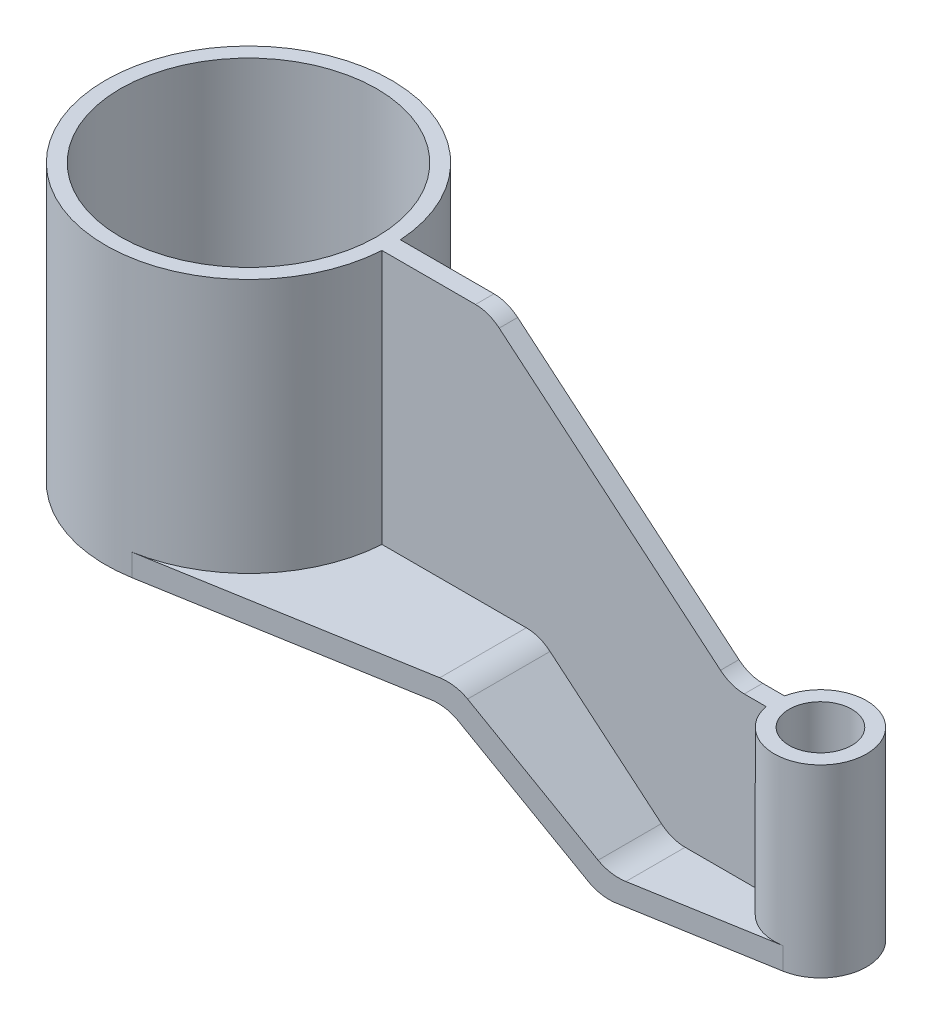
ISO-10303-21;
HEADER;
FILE_DESCRIPTION(('STEP AP214'),'2;1');
FILE_NAME('part.step','',(''),(''),'','','');
FILE_SCHEMA(('AUTOMOTIVE_DESIGN { 1 0 10303 214 1 1 1 1 }'));
ENDSEC;
DATA;
#1=APPLICATION_CONTEXT('core data for automotive mechanical design processes');
#2=APPLICATION_PROTOCOL_DEFINITION('international standard','automotive_design',2000,#1);
#3=PRODUCT_CONTEXT('',#1,'mechanical');
#4=PRODUCT('Part','Part','',(#3));
#5=PRODUCT_RELATED_PRODUCT_CATEGORY('part','',(#4));
#6=PRODUCT_DEFINITION_FORMATION('','',#4);
#7=PRODUCT_DEFINITION_CONTEXT('part definition',#1,'design');
#8=PRODUCT_DEFINITION('design','',#6,#7);
#9=PRODUCT_DEFINITION_SHAPE('','',#8);
#10=(LENGTH_UNIT() NAMED_UNIT(*) SI_UNIT(.MILLI.,.METRE.));
#11=(NAMED_UNIT(*) PLANE_ANGLE_UNIT() SI_UNIT($,.RADIAN.));
#12=(NAMED_UNIT(*) SI_UNIT($,.STERADIAN.) SOLID_ANGLE_UNIT());
#13=UNCERTAINTY_MEASURE_WITH_UNIT(LENGTH_MEASURE(1.E-05),#10,'distance_accuracy_value','');
#14=(GEOMETRIC_REPRESENTATION_CONTEXT(3) GLOBAL_UNCERTAINTY_ASSIGNED_CONTEXT((#13)) GLOBAL_UNIT_ASSIGNED_CONTEXT((#10,
#11,#12)) REPRESENTATION_CONTEXT('',''));
#15=CARTESIAN_POINT('',(0.,0.,0.));
#16=DIRECTION('',(0.,0.,1.));
#17=DIRECTION('',(1.,0.,0.));
#18=AXIS2_PLACEMENT_3D('',#15,#16,#17);
#19=CARTESIAN_POINT('',(-38.75,6.,115.));
#20=DIRECTION('',(0.,-1.,0.));
#21=DIRECTION('',(0.,0.,-1.));
#22=AXIS2_PLACEMENT_3D('',#19,#20,#21);
#23=PLANE('',#22);
#24=DIRECTION('',(-1.,0.,0.));
#25=VECTOR('',#24,1.);
#26=CARTESIAN_POINT('',(-38.75,6.,-2.5));
#27=LINE('',#26,#25);
#28=CARTESIAN_POINT('',(77.7915112851085,6.,-2.5));
#29=VERTEX_POINT('',#28);
#30=CARTESIAN_POINT('',(38.6692707456451,6.00000000000001,-2.5));
#31=VERTEX_POINT('',#30);
#32=EDGE_CURVE('E239',#29,#31,#27,.T.);
#33=ORIENTED_EDGE('',*,*,#32,.F.);
#34=DIRECTION('',(0.,0.,-1.));
#35=VECTOR('',#34,1.);
#36=CARTESIAN_POINT('',(77.7915112851085,6.,115.));
#37=LINE('',#36,#35);
#38=CARTESIAN_POINT('',(77.7915112851085,6.,-25.9504821743771));
#39=VERTEX_POINT('',#38);
#40=EDGE_CURVE('E357',#29,#39,#37,.T.);
#41=ORIENTED_EDGE('',*,*,#40,.T.);
#42=DIRECTION('',(-0.985555142346495,0.,-0.169354838709677));
#43=VECTOR('',#42,1.);
#44=CARTESIAN_POINT('',(-11.8816276712356,6.,-41.3596453272218));
#45=LINE('',#44,#43);
#46=CARTESIAN_POINT('',(6.5625,6.,-38.1902617659267));
#47=VERTEX_POINT('',#46);
#48=EDGE_CURVE('E286',#39,#47,#45,.T.);
#49=ORIENTED_EDGE('',*,*,#48,.T.);
#50=CARTESIAN_POINT('',(0.,6.00000000000001,0.));
#51=DIRECTION('',(0.,-1.,0.));
#52=DIRECTION('',(0.,0.,-1.));
#53=AXIS2_PLACEMENT_3D('',#50,#51,#52);
#54=CIRCLE('',#53,38.75);
#55=EDGE_CURVE('E305',#47,#31,#54,.T.);
#56=ORIENTED_EDGE('',*,*,#55,.T.);
#57=EDGE_LOOP('',(#33,#41,#49,#56));
#58=FACE_BOUND('',#57,.T.);
#59=ADVANCED_FACE('F37',(#58),#23,.F.);
#60=CARTESIAN_POINT('',(167.5,-24.,115.));
#61=DIRECTION('',(0.,-1.,0.));
#62=DIRECTION('',(1.,0.,0.));
#63=AXIS2_PLACEMENT_3D('',#60,#61,#62);
#64=PLANE('',#63);
#65=DIRECTION('',(-0.985555142346495,0.,-0.169354838709677));
#66=VECTOR('',#65,1.);
#67=CARTESIAN_POINT('',(188.452903416173,-24.,-6.93476056683261));
#68=LINE('',#67,#66);
#69=CARTESIAN_POINT('',(157.116935483871,-24.,-12.3194392793312));
#70=VERTEX_POINT('',#69);
#71=CARTESIAN_POINT('',(120.823523748259,-24.,-18.5559902612219));
#72=VERTEX_POINT('',#71);
#73=EDGE_CURVE('E283',#70,#72,#68,.T.);
#74=ORIENTED_EDGE('',*,*,#73,.T.);
#75=DIRECTION('',(0.,0.,-1.));
#76=VECTOR('',#75,1.);
#77=CARTESIAN_POINT('',(120.823523748259,-24.,-2.5));
#78=LINE('',#77,#76);
#79=CARTESIAN_POINT('',(120.823523748259,-24.,-2.5));
#80=VERTEX_POINT('',#79);
#81=EDGE_CURVE('E364',#72,#80,#78,.F.);
#82=ORIENTED_EDGE('',*,*,#81,.T.);
#83=DIRECTION('',(-1.,0.,0.));
#84=VECTOR('',#83,1.);
#85=CARTESIAN_POINT('',(167.5,-24.,-2.5));
#86=LINE('',#85,#84);
#87=CARTESIAN_POINT('',(142.752551286084,-24.,-2.5));
#88=VERTEX_POINT('',#87);
#89=EDGE_CURVE('E228',#88,#80,#86,.T.);
#90=ORIENTED_EDGE('',*,*,#89,.F.);
#91=CARTESIAN_POINT('',(155.,-24.,0.));
#92=DIRECTION('',(0.,-1.,0.));
#93=DIRECTION('',(1.,0.,0.));
#94=AXIS2_PLACEMENT_3D('',#91,#92,#93);
#95=CIRCLE('',#94,12.5);
#96=EDGE_CURVE('E227',#70,#88,#95,.F.);
#97=ORIENTED_EDGE('',*,*,#96,.F.);
#98=EDGE_LOOP('',(#74,#82,#90,#97));
#99=FACE_BOUND('',#98,.T.);
#100=ADVANCED_FACE('F467',(#99),#64,.F.);
#101=CARTESIAN_POINT('',(118.856725658119,-25.4037333412861,115.));
#102=DIRECTION('',(-0.642787609686535,-0.766044443118982,0.));
#103=DIRECTION('',(0.766044443118982,-0.642787609686535,0.));
#104=AXIS2_PLACEMENT_3D('',#101,#102,#103);
#105=PLANE('',#104);
#106=DIRECTION('',(-0.759492568105109,0.637289933778875,-0.130508924205297));
#107=VECTOR('',#106,1.);
#108=CARTESIAN_POINT('',(132.128369582196,-36.539964863095,-16.613399470933));
#109=LINE('',#108,#107);
#110=CARTESIAN_POINT('',(114.395647651394,-21.6604444311898,-19.6605372042155));
#111=VERTEX_POINT('',#110);
#112=CARTESIAN_POINT('',(84.2193873819738,3.66044443118982,-24.8459352313835));
#113=VERTEX_POINT('',#112);
#114=EDGE_CURVE('E281',#111,#113,#109,.T.);
#115=ORIENTED_EDGE('',*,*,#114,.T.);
#116=DIRECTION('',(0.,0.,-1.));
#117=VECTOR('',#116,1.);
#118=CARTESIAN_POINT('',(84.2193873819738,3.66044443118981,115.));
#119=LINE('',#118,#117);
#120=CARTESIAN_POINT('',(84.2193873819738,3.66044443118981,-2.5));
#121=VERTEX_POINT('',#120);
#122=EDGE_CURVE('E52',#113,#121,#119,.F.);
#123=ORIENTED_EDGE('',*,*,#122,.T.);
#124=DIRECTION('',(-0.766044443118982,0.642787609686535,0.));
#125=VECTOR('',#124,1.);
#126=CARTESIAN_POINT('',(118.856725658119,-25.4037333412861,-2.5));
#127=LINE('',#126,#125);
#128=CARTESIAN_POINT('',(114.395647651394,-21.6604444311898,-2.5));
#129=VERTEX_POINT('',#128);
#130=EDGE_CURVE('E231',#129,#121,#127,.T.);
#131=ORIENTED_EDGE('',*,*,#130,.F.);
#132=DIRECTION('',(0.,0.,-1.));
#133=VECTOR('',#132,1.);
#134=CARTESIAN_POINT('',(114.395647651394,-21.6604444311898,-19.1814257916227));
#135=LINE('',#134,#133);
#136=EDGE_CURVE('E360',#129,#111,#135,.T.);
#137=ORIENTED_EDGE('',*,*,#136,.T.);
#138=EDGE_LOOP('',(#115,#123,#131,#137));
#139=FACE_BOUND('',#138,.T.);
#140=ADVANCED_FACE('F459',(#139),#105,.F.);
#141=CARTESIAN_POINT('',(0.,75.,0.));
#142=DIRECTION('',(0.,1.,0.));
#143=DIRECTION('',(0.,0.,1.));
#144=AXIS2_PLACEMENT_3D('',#141,#142,#143);
#145=PLANE('',#144);
#146=CARTESIAN_POINT('',(0.,75.,0.));
#147=DIRECTION('',(0.,1.,0.));
#148=DIRECTION('',(0.,0.,1.));
#149=AXIS2_PLACEMENT_3D('',#146,#147,#148);
#150=CIRCLE('',#149,34.75);
#151=CARTESIAN_POINT('',(0.,75.,34.75));
#152=VERTEX_POINT('',#151);
#153=EDGE_CURVE('E320',#152,#152,#150,.T.);
#154=ORIENTED_EDGE('',*,*,#153,.F.);
#155=EDGE_LOOP('',(#154));
#156=FACE_BOUND('',#155,.T.);
#157=DIRECTION('',(1.,0.,0.));
#158=VECTOR('',#157,1.);
#159=CARTESIAN_POINT('',(64.375,75.,2.5));
#160=LINE('',#159,#158);
#161=CARTESIAN_POINT('',(64.0123617779656,75.,2.5));
#162=VERTEX_POINT('',#161);
#163=CARTESIAN_POINT('',(38.6692707456451,75.,2.5));
#164=VERTEX_POINT('',#163);
#165=EDGE_CURVE('E229',#162,#164,#160,.F.);
#166=ORIENTED_EDGE('',*,*,#165,.F.);
#167=DIRECTION('',(0.,0.,1.));
#168=VECTOR('',#167,1.);
#169=CARTESIAN_POINT('',(64.0123617779656,75.,0.));
#170=LINE('',#169,#168);
#171=CARTESIAN_POINT('',(64.0123617779656,75.,-2.5));
#172=VERTEX_POINT('',#171);
#173=EDGE_CURVE('E350',#162,#172,#170,.F.);
#174=ORIENTED_EDGE('',*,*,#173,.T.);
#175=DIRECTION('',(1.,0.,0.));
#176=VECTOR('',#175,1.);
#177=CARTESIAN_POINT('',(64.375,75.,-2.5));
#178=LINE('',#177,#176);
#179=CARTESIAN_POINT('',(38.6692707456451,75.,-2.5));
#180=VERTEX_POINT('',#179);
#181=EDGE_CURVE('E236',#172,#180,#178,.F.);
#182=ORIENTED_EDGE('',*,*,#181,.T.);
#183=CARTESIAN_POINT('',(0.,75.,0.));
#184=DIRECTION('',(0.,1.,0.));
#185=DIRECTION('',(0.,0.,1.));
#186=AXIS2_PLACEMENT_3D('',#183,#184,#185);
#187=CIRCLE('',#186,38.75);
#188=EDGE_CURVE('E211',#180,#164,#187,.T.);
#189=ORIENTED_EDGE('',*,*,#188,.T.);
#190=EDGE_LOOP('',(#166,#174,#182,#189));
#191=FACE_BOUND('',#190,.T.);
#192=ADVANCED_FACE('F451',(#156,#191),#145,.T.);
#193=DIRECTION('',(-0.985555142346495,0.,0.169354838709677));
#194=VECTOR('',#193,1.);
#195=CARTESIAN_POINT('',(-50.2705900706999,6.,47.9562894479293));
#196=LINE('',#195,#194);
#197=CARTESIAN_POINT('',(77.7915112851085,6.,25.9504821743771));
#198=VERTEX_POINT('',#197);
#199=CARTESIAN_POINT('',(6.5625,6.,38.1902617659267));
#200=VERTEX_POINT('',#199);
#201=EDGE_CURVE('E300',#198,#200,#196,.T.);
#202=ORIENTED_EDGE('',*,*,#201,.F.);
#203=DIRECTION('',(0.,0.,-1.));
#204=VECTOR('',#203,1.);
#205=CARTESIAN_POINT('',(77.7915112851085,6.,115.));
#206=LINE('',#205,#204);
#207=CARTESIAN_POINT('',(77.7915112851085,6.,2.5));
#208=VERTEX_POINT('',#207);
#209=EDGE_CURVE('E373',#198,#208,#206,.T.);
#210=ORIENTED_EDGE('',*,*,#209,.T.);
#211=DIRECTION('',(-1.,0.,0.));
#212=VECTOR('',#211,1.);
#213=CARTESIAN_POINT('',(-38.75,6.,2.5));
#214=LINE('',#213,#212);
#215=CARTESIAN_POINT('',(38.6692707456451,6.00000000000001,2.5));
#216=VERTEX_POINT('',#215);
#217=EDGE_CURVE('E252',#208,#216,#214,.T.);
#218=ORIENTED_EDGE('',*,*,#217,.T.);
#219=EDGE_CURVE('E304',#216,#200,#54,.T.);
#220=ORIENTED_EDGE('',*,*,#219,.T.);
#221=EDGE_LOOP('',(#202,#210,#218,#220));
#222=FACE_BOUND('',#221,.T.);
#223=ADVANCED_FACE('F443',(#222),#23,.F.);
#224=DIRECTION('',(-1.,0.,0.));
#225=VECTOR('',#224,1.);
#226=CARTESIAN_POINT('',(167.5,-24.,2.5));
#227=LINE('',#226,#225);
#228=CARTESIAN_POINT('',(142.752551286084,-24.,2.5));
#229=VERTEX_POINT('',#228);
#230=CARTESIAN_POINT('',(120.823523748259,-24.,2.5));
#231=VERTEX_POINT('',#230);
#232=EDGE_CURVE('E246',#229,#231,#227,.T.);
#233=ORIENTED_EDGE('',*,*,#232,.T.);
#234=DIRECTION('',(0.,0.,-1.));
#235=VECTOR('',#234,1.);
#236=CARTESIAN_POINT('',(120.823523748259,-24.,19.1814257916227));
#237=LINE('',#236,#235);
#238=CARTESIAN_POINT('',(120.823523748259,-24.,18.5559902612219));
#239=VERTEX_POINT('',#238);
#240=EDGE_CURVE('E371',#231,#239,#237,.F.);
#241=ORIENTED_EDGE('',*,*,#240,.T.);
#242=DIRECTION('',(-0.985555142346495,0.,0.169354838709677));
#243=VECTOR('',#242,1.);
#244=CARTESIAN_POINT('',(150.063941016709,-24.,13.5314046875402));
#245=LINE('',#244,#243);
#246=CARTESIAN_POINT('',(157.116935483871,-24.,12.3194392793312));
#247=VERTEX_POINT('',#246);
#248=EDGE_CURVE('E297',#247,#239,#245,.T.);
#249=ORIENTED_EDGE('',*,*,#248,.F.);
#250=EDGE_CURVE('E308',#229,#247,#95,.F.);
#251=ORIENTED_EDGE('',*,*,#250,.F.);
#252=EDGE_LOOP('',(#233,#241,#249,#251));
#253=FACE_BOUND('',#252,.T.);
#254=ADVANCED_FACE('F406',(#253),#64,.F.);
#255=DIRECTION('',(-0.759492568105109,0.637289933778875,0.130508924205297));
#256=VECTOR('',#255,1.);
#257=CARTESIAN_POINT('',(109.330641240973,-17.4103994202955,20.5308927092945));
#258=LINE('',#257,#256);
#259=CARTESIAN_POINT('',(114.395647651394,-21.6604444311898,19.6605372042155));
#260=VERTEX_POINT('',#259);
#261=CARTESIAN_POINT('',(84.2193873819738,3.66044443118982,24.8459352313835));
#262=VERTEX_POINT('',#261);
#263=EDGE_CURVE('E294',#260,#262,#258,.T.);
#264=ORIENTED_EDGE('',*,*,#263,.F.);
#265=DIRECTION('',(0.,0.,-1.));
#266=VECTOR('',#265,1.);
#267=CARTESIAN_POINT('',(114.395647651394,-21.6604444311898,2.5));
#268=LINE('',#267,#266);
#269=CARTESIAN_POINT('',(114.395647651394,-21.6604444311898,2.5));
#270=VERTEX_POINT('',#269);
#271=EDGE_CURVE('E368',#260,#270,#268,.T.);
#272=ORIENTED_EDGE('',*,*,#271,.T.);
#273=DIRECTION('',(-0.766044443118982,0.642787609686535,0.));
#274=VECTOR('',#273,1.);
#275=CARTESIAN_POINT('',(118.856725658119,-25.4037333412861,2.5));
#276=LINE('',#275,#274);
#277=CARTESIAN_POINT('',(84.2193873819738,3.66044443118981,2.5));
#278=VERTEX_POINT('',#277);
#279=EDGE_CURVE('E249',#270,#278,#276,.T.);
#280=ORIENTED_EDGE('',*,*,#279,.T.);
#281=DIRECTION('',(0.,0.,-1.));
#282=VECTOR('',#281,1.);
#283=CARTESIAN_POINT('',(84.2193873819738,3.66044443118981,115.));
#284=LINE('',#283,#282);
#285=EDGE_CURVE('E366',#278,#262,#284,.F.);
#286=ORIENTED_EDGE('',*,*,#285,.T.);
#287=EDGE_LOOP('',(#264,#272,#280,#286));
#288=FACE_BOUND('',#287,.T.);
#289=ADVANCED_FACE('F397',(#288),#105,.F.);
#290=CARTESIAN_POINT('',(0.,75.,0.));
#291=DIRECTION('',(0.,-1.,0.));
#292=DIRECTION('',(0.,0.,-1.));
#293=AXIS2_PLACEMENT_3D('',#290,#291,#292);
#294=CYLINDRICAL_SURFACE('',#293,38.75);
#295=DIRECTION('',(0.,-1.,0.));
#296=VECTOR('',#295,1.);
#297=CARTESIAN_POINT('',(38.6692707456451,75.,2.5));
#298=LINE('',#297,#296);
#299=EDGE_CURVE('E254',#216,#164,#298,.F.);
#300=ORIENTED_EDGE('',*,*,#299,.T.);
#301=ORIENTED_EDGE('',*,*,#188,.F.);
#302=DIRECTION('',(0.,-1.,0.));
#303=VECTOR('',#302,1.);
#304=CARTESIAN_POINT('',(38.6692707456451,75.,-2.5));
#305=LINE('',#304,#303);
#306=EDGE_CURVE('E241',#31,#180,#305,.F.);
#307=ORIENTED_EDGE('',*,*,#306,.F.);
#308=ORIENTED_EDGE('',*,*,#55,.F.);
#309=DIRECTION('',(0.,1.,0.));
#310=VECTOR('',#309,1.);
#311=CARTESIAN_POINT('',(6.5625,-30.,-38.1902617659267));
#312=LINE('',#311,#310);
#313=CARTESIAN_POINT('',(6.5625,0.,-38.1902617659267));
#314=VERTEX_POINT('',#313);
#315=EDGE_CURVE('E272',#314,#47,#312,.T.);
#316=ORIENTED_EDGE('',*,*,#315,.F.);
#317=CARTESIAN_POINT('',(0.,0.,0.));
#318=DIRECTION('',(0.,1.,0.));
#319=DIRECTION('',(0.,0.,1.));
#320=AXIS2_PLACEMENT_3D('',#317,#318,#319);
#321=CIRCLE('',#320,38.75);
#322=CARTESIAN_POINT('',(6.5625,0.,38.1902617659267));
#323=VERTEX_POINT('',#322);
#324=EDGE_CURVE('E313',#314,#323,#321,.T.);
#325=ORIENTED_EDGE('',*,*,#324,.T.);
#326=DIRECTION('',(0.,1.,0.));
#327=VECTOR('',#326,1.);
#328=CARTESIAN_POINT('',(6.5625,-30.,38.1902617659267));
#329=LINE('',#328,#327);
#330=EDGE_CURVE('E269',#323,#200,#329,.T.);
#331=ORIENTED_EDGE('',*,*,#330,.T.);
#332=ORIENTED_EDGE('',*,*,#219,.F.);
#333=EDGE_LOOP('',(#300,#301,#307,#308,#316,#325,#331,#332));
#334=FACE_BOUND('',#333,.T.);
#335=ADVANCED_FACE('F436',(#334),#294,.T.);
#336=CARTESIAN_POINT('',(155.,20.,0.));
#337=DIRECTION('',(0.,-1.,0.));
#338=DIRECTION('',(0.,0.,-1.));
#339=AXIS2_PLACEMENT_3D('',#336,#337,#338);
#340=CYLINDRICAL_SURFACE('',#339,12.5);
#341=CARTESIAN_POINT('',(155.,20.,0.));
#342=DIRECTION('',(0.,1.,0.));
#343=DIRECTION('',(0.,0.,1.));
#344=AXIS2_PLACEMENT_3D('',#341,#342,#343);
#345=CIRCLE('',#344,12.5);
#346=CARTESIAN_POINT('',(142.752551286084,20.,2.5));
#347=VERTEX_POINT('',#346);
#348=CARTESIAN_POINT('',(142.752551286084,20.,-2.5));
#349=VERTEX_POINT('',#348);
#350=EDGE_CURVE('E199',#347,#349,#345,.T.);
#351=ORIENTED_EDGE('',*,*,#350,.F.);
#352=DIRECTION('',(0.,-1.,0.));
#353=VECTOR('',#352,1.);
#354=CARTESIAN_POINT('',(142.752551286084,20.,2.5));
#355=LINE('',#354,#353);
#356=EDGE_CURVE('E244',#347,#229,#355,.T.);
#357=ORIENTED_EDGE('',*,*,#356,.T.);
#358=ORIENTED_EDGE('',*,*,#250,.T.);
#359=DIRECTION('',(0.,1.,0.));
#360=VECTOR('',#359,1.);
#361=CARTESIAN_POINT('',(157.116935483871,-30.,12.3194392793312));
#362=LINE('',#361,#360);
#363=CARTESIAN_POINT('',(157.116935483871,-30.,12.3194392793312));
#364=VERTEX_POINT('',#363);
#365=EDGE_CURVE('E265',#364,#247,#362,.T.);
#366=ORIENTED_EDGE('',*,*,#365,.F.);
#367=CARTESIAN_POINT('',(155.,-30.,0.));
#368=DIRECTION('',(0.,1.,0.));
#369=DIRECTION('',(0.,0.,1.));
#370=AXIS2_PLACEMENT_3D('',#367,#368,#369);
#371=CIRCLE('',#370,12.5);
#372=CARTESIAN_POINT('',(157.116935483871,-30.,-12.3194392793312));
#373=VERTEX_POINT('',#372);
#374=EDGE_CURVE('E257',#364,#373,#371,.T.);
#375=ORIENTED_EDGE('',*,*,#374,.T.);
#376=DIRECTION('',(0.,1.,0.));
#377=VECTOR('',#376,1.);
#378=CARTESIAN_POINT('',(157.116935483871,-30.,-12.3194392793312));
#379=LINE('',#378,#377);
#380=EDGE_CURVE('E264',#373,#70,#379,.T.);
#381=ORIENTED_EDGE('',*,*,#380,.T.);
#382=ORIENTED_EDGE('',*,*,#96,.T.);
#383=DIRECTION('',(0.,-1.,0.));
#384=VECTOR('',#383,1.);
#385=CARTESIAN_POINT('',(142.752551286084,20.,-2.5));
#386=LINE('',#385,#384);
#387=EDGE_CURVE('E216',#349,#88,#386,.T.);
#388=ORIENTED_EDGE('',*,*,#387,.F.);
#389=EDGE_LOOP('',(#351,#357,#358,#366,#375,#381,#382,#388));
#390=FACE_BOUND('',#389,.T.);
#391=ADVANCED_FACE('F224',(#390),#340,.T.);
#392=CARTESIAN_POINT('',(155.,20.,0.));
#393=DIRECTION('',(0.,1.,0.));
#394=DIRECTION('',(0.,0.,1.));
#395=AXIS2_PLACEMENT_3D('',#392,#393,#394);
#396=PLANE('',#395);
#397=CARTESIAN_POINT('',(155.,20.,0.));
#398=DIRECTION('',(0.,1.,0.));
#399=DIRECTION('',(0.,0.,1.));
#400=AXIS2_PLACEMENT_3D('',#397,#398,#399);
#401=CIRCLE('',#400,8.50000000000001);
#402=CARTESIAN_POINT('',(155.,20.,8.50000000000001));
#403=VERTEX_POINT('',#402);
#404=EDGE_CURVE('E310',#403,#403,#401,.T.);
#405=ORIENTED_EDGE('',*,*,#404,.F.);
#406=EDGE_LOOP('',(#405));
#407=FACE_BOUND('',#406,.T.);
#408=DIRECTION('',(1.,0.,0.));
#409=VECTOR('',#408,1.);
#410=CARTESIAN_POINT('',(64.375,20.,-2.5));
#411=LINE('',#410,#409);
#412=CARTESIAN_POINT('',(136.838214055972,20.,-2.5));
#413=VERTEX_POINT('',#412);
#414=EDGE_CURVE('E203',#349,#413,#411,.F.);
#415=ORIENTED_EDGE('',*,*,#414,.T.);
#416=DIRECTION('',(0.,0.,1.));
#417=VECTOR('',#416,1.);
#418=CARTESIAN_POINT('',(136.838214055972,20.,2.5));
#419=LINE('',#418,#417);
#420=CARTESIAN_POINT('',(136.838214055972,20.,2.5));
#421=VERTEX_POINT('',#420);
#422=EDGE_CURVE('E355',#413,#421,#419,.T.);
#423=ORIENTED_EDGE('',*,*,#422,.T.);
#424=DIRECTION('',(1.,0.,0.));
#425=VECTOR('',#424,1.);
#426=CARTESIAN_POINT('',(64.375,20.,2.5));
#427=LINE('',#426,#425);
#428=EDGE_CURVE('E206',#347,#421,#427,.F.);
#429=ORIENTED_EDGE('',*,*,#428,.F.);
#430=ORIENTED_EDGE('',*,*,#350,.T.);
#431=EDGE_LOOP('',(#415,#423,#429,#430));
#432=FACE_BOUND('',#431,.T.);
#433=ADVANCED_FACE('F201',(#407,#432),#396,.T.);
#434=CARTESIAN_POINT('',(155.,-30.,0.));
#435=DIRECTION('',(0.,1.,0.));
#436=DIRECTION('',(0.,0.,1.));
#437=AXIS2_PLACEMENT_3D('',#434,#435,#436);
#438=CYLINDRICAL_SURFACE('',#437,8.50000000000001);
#439=CARTESIAN_POINT('',(155.,-30.,0.));
#440=DIRECTION('',(0.,-1.,0.));
#441=DIRECTION('',(1.,0.,0.));
#442=AXIS2_PLACEMENT_3D('',#439,#440,#441);
#443=CIRCLE('',#442,8.50000000000001);
#444=CARTESIAN_POINT('',(163.5,-30.,0.));
#445=VERTEX_POINT('',#444);
#446=EDGE_CURVE('E315',#445,#445,#443,.T.);
#447=ORIENTED_EDGE('',*,*,#446,.T.);
#448=EDGE_LOOP('',(#447));
#449=FACE_BOUND('',#448,.T.);
#450=ORIENTED_EDGE('',*,*,#404,.T.);
#451=EDGE_LOOP('',(#450));
#452=FACE_BOUND('',#451,.T.);
#453=ADVANCED_FACE('F491',(#449,#452),#438,.F.);
#454=CARTESIAN_POINT('',(0.,0.,0.));
#455=DIRECTION('',(0.,1.,0.));
#456=DIRECTION('',(0.,0.,1.));
#457=AXIS2_PLACEMENT_3D('',#454,#455,#456);
#458=PLANE('',#457);
#459=CARTESIAN_POINT('',(0.,0.,0.));
#460=DIRECTION('',(0.,1.,0.));
#461=DIRECTION('',(0.,0.,1.));
#462=AXIS2_PLACEMENT_3D('',#459,#460,#461);
#463=CIRCLE('',#462,34.75);
#464=CARTESIAN_POINT('',(0.,0.,34.75));
#465=VERTEX_POINT('',#464);
#466=EDGE_CURVE('E212',#465,#465,#463,.T.);
#467=ORIENTED_EDGE('',*,*,#466,.T.);
#468=EDGE_LOOP('',(#467));
#469=FACE_BOUND('',#468,.T.);
#470=DIRECTION('',(0.985555142346495,0.,0.169354838709677));
#471=VECTOR('',#470,1.);
#472=CARTESIAN_POINT('',(6.5625,0.,-38.1902617659267));
#473=LINE('',#472,#471);
#474=CARTESIAN_POINT('',(75.6076898795113,0.,-26.3257434926176));
#475=VERTEX_POINT('',#474);
#476=EDGE_CURVE('E268',#314,#475,#473,.T.);
#477=ORIENTED_EDGE('',*,*,#476,.T.);
#478=DIRECTION('',(0.,0.,-1.));
#479=VECTOR('',#478,1.);
#480=CARTESIAN_POINT('',(75.6076898795113,0.,0.));
#481=LINE('',#480,#479);
#482=CARTESIAN_POINT('',(75.6076898795113,0.,26.3257434926176));
#483=VERTEX_POINT('',#482);
#484=EDGE_CURVE('E339',#475,#483,#481,.F.);
#485=ORIENTED_EDGE('',*,*,#484,.T.);
#486=DIRECTION('',(0.985555142346495,0.,-0.169354838709677));
#487=VECTOR('',#486,1.);
#488=CARTESIAN_POINT('',(6.5625,0.,38.1902617659267));
#489=LINE('',#488,#487);
#490=EDGE_CURVE('E288',#323,#483,#489,.T.);
#491=ORIENTED_EDGE('',*,*,#490,.F.);
#492=ORIENTED_EDGE('',*,*,#324,.F.);
#493=EDGE_LOOP('',(#477,#485,#491,#492));
#494=FACE_BOUND('',#493,.T.);
#495=ADVANCED_FACE('F432',(#469,#494),#458,.F.);
#496=CARTESIAN_POINT('',(167.5,-30.,115.));
#497=DIRECTION('',(0.,-1.,0.));
#498=DIRECTION('',(1.,0.,0.));
#499=AXIS2_PLACEMENT_3D('',#496,#497,#498);
#500=PLANE('',#499);
#501=ORIENTED_EDGE('',*,*,#446,.F.);
#502=EDGE_LOOP('',(#501));
#503=FACE_BOUND('',#502,.T.);
#504=DIRECTION('',(0.985555142346495,0.,-0.169354838709677));
#505=VECTOR('',#504,1.);
#506=CARTESIAN_POINT('',(6.5625,-30.,38.1902617659267));
#507=LINE('',#506,#505);
#508=CARTESIAN_POINT('',(118.639702342662,-30.,18.9312515794624));
#509=VERTEX_POINT('',#508);
#510=EDGE_CURVE('E262',#509,#364,#507,.T.);
#511=ORIENTED_EDGE('',*,*,#510,.F.);
#512=DIRECTION('',(0.,0.,-1.));
#513=VECTOR('',#512,1.);
#514=CARTESIAN_POINT('',(118.639702342662,-30.,115.));
#515=LINE('',#514,#513);
#516=CARTESIAN_POINT('',(118.639702342662,-30.,-18.9312515794624));
#517=VERTEX_POINT('',#516);
#518=EDGE_CURVE('E323',#509,#517,#515,.T.);
#519=ORIENTED_EDGE('',*,*,#518,.T.);
#520=DIRECTION('',(0.985555142346495,0.,0.169354838709677));
#521=VECTOR('',#520,1.);
#522=CARTESIAN_POINT('',(6.5625,-30.,-38.1902617659267));
#523=LINE('',#522,#521);
#524=EDGE_CURVE('E260',#517,#373,#523,.T.);
#525=ORIENTED_EDGE('',*,*,#524,.T.);
#526=ORIENTED_EDGE('',*,*,#374,.F.);
#527=EDGE_LOOP('',(#511,#519,#525,#526));
#528=FACE_BOUND('',#527,.T.);
#529=ADVANCED_FACE('F413',(#503,#528),#500,.T.);
#530=CARTESIAN_POINT('',(115.,-30.,115.));
#531=DIRECTION('',(-0.642787609686535,-0.766044443118982,0.));
#532=DIRECTION('',(0.766044443118982,-0.642787609686535,0.));
#533=AXIS2_PLACEMENT_3D('',#530,#531,#532);
#534=PLANE('',#533);
#535=DIRECTION('',(-0.759492568105109,0.637289933778875,-0.130508924205297));
#536=VECTOR('',#535,1.);
#537=CARTESIAN_POINT('',(128.337333909676,-41.1913519644975,-17.2648396666927));
#538=LINE('',#537,#536);
#539=CARTESIAN_POINT('',(112.211826245797,-27.6604444311898,-20.035798522456));
#540=VERTEX_POINT('',#539);
#541=CARTESIAN_POINT('',(82.0355659763766,-2.33955556881018,-25.221196549624));
#542=VERTEX_POINT('',#541);
#543=EDGE_CURVE('E278',#540,#542,#538,.T.);
#544=ORIENTED_EDGE('',*,*,#543,.F.);
#545=DIRECTION('',(0.,0.,-1.));
#546=VECTOR('',#545,1.);
#547=CARTESIAN_POINT('',(112.211826245797,-27.6604444311898,115.));
#548=LINE('',#547,#546);
#549=CARTESIAN_POINT('',(112.211826245797,-27.6604444311898,20.035798522456));
#550=VERTEX_POINT('',#549);
#551=EDGE_CURVE('E333',#540,#550,#548,.F.);
#552=ORIENTED_EDGE('',*,*,#551,.T.);
#553=DIRECTION('',(-0.759492568105109,0.637289933778875,0.130508924205297));
#554=VECTOR('',#553,1.);
#555=CARTESIAN_POINT('',(105.539605568454,-22.061786521698,21.1823329050542));
#556=LINE('',#555,#554);
#557=CARTESIAN_POINT('',(82.0355659763766,-2.33955556881019,25.221196549624));
#558=VERTEX_POINT('',#557);
#559=EDGE_CURVE('E291',#550,#558,#556,.T.);
#560=ORIENTED_EDGE('',*,*,#559,.T.);
#561=DIRECTION('',(0.,0.,-1.));
#562=VECTOR('',#561,1.);
#563=CARTESIAN_POINT('',(82.0355659763766,-2.33955556881019,115.));
#564=LINE('',#563,#562);
#565=EDGE_CURVE('E330',#558,#542,#564,.T.);
#566=ORIENTED_EDGE('',*,*,#565,.T.);
#567=EDGE_LOOP('',(#544,#552,#560,#566));
#568=FACE_BOUND('',#567,.T.);
#569=ADVANCED_FACE('F423',(#568),#534,.T.);
#570=CARTESIAN_POINT('',(6.5625,-30.,-38.1902617659267));
#571=DIRECTION('',(-0.169354838709677,0.,0.985555142346495));
#572=DIRECTION('',(0.985555142346495,0.,0.169354838709677));
#573=AXIS2_PLACEMENT_3D('',#570,#571,#572);
#574=PLANE('',#573);
#575=ORIENTED_EDGE('',*,*,#524,.F.);
#576=CARTESIAN_POINT('',(118.639702342662,-20.,-18.9312515794624));
#577=DIRECTION('',(-0.169354838709677,0.,0.985555142346495));
#578=DIRECTION('',(-0.985555142346495,0.,-0.169354838709677));
#579=AXIS2_PLACEMENT_3D('',#576,#577,#578);
#580=ELLIPSE('',#579,10.1465656971675,10.);
#581=EDGE_CURVE('E328',#517,#540,#580,.F.);
#582=ORIENTED_EDGE('',*,*,#581,.T.);
#583=ORIENTED_EDGE('',*,*,#543,.T.);
#584=CARTESIAN_POINT('',(75.6076898795113,-10.,-26.3257434926176));
#585=DIRECTION('',(-0.169354838709677,0.,0.985555142346495));
#586=DIRECTION('',(-0.985555142346495,0.,-0.169354838709677));
#587=AXIS2_PLACEMENT_3D('',#584,#585,#586);
#588=ELLIPSE('',#587,10.1465656971675,10.);
#589=EDGE_CURVE('E376',#542,#475,#588,.T.);
#590=ORIENTED_EDGE('',*,*,#589,.T.);
#591=ORIENTED_EDGE('',*,*,#476,.F.);
#592=ORIENTED_EDGE('',*,*,#315,.T.);
#593=ORIENTED_EDGE('',*,*,#48,.F.);
#594=CARTESIAN_POINT('',(77.7915112851085,-4.,-25.9504821743771));
#595=DIRECTION('',(-0.169354838709677,0.,0.985555142346495));
#596=DIRECTION('',(-0.985555142346495,0.,-0.169354838709677));
#597=AXIS2_PLACEMENT_3D('',#594,#595,#596);
#598=ELLIPSE('',#597,10.1465656971675,10.);
#599=EDGE_CURVE('E326',#39,#113,#598,.F.);
#600=ORIENTED_EDGE('',*,*,#599,.T.);
#601=ORIENTED_EDGE('',*,*,#114,.F.);
#602=CARTESIAN_POINT('',(120.823523748259,-14.,-18.5559902612219));
#603=DIRECTION('',(-0.169354838709677,0.,0.985555142346495));
#604=DIRECTION('',(0.985555142346495,0.,0.169354838709677));
#605=AXIS2_PLACEMENT_3D('',#602,#603,#604);
#606=ELLIPSE('',#605,10.1465656971675,10.);
#607=EDGE_CURVE('E385',#111,#72,#606,.T.);
#608=ORIENTED_EDGE('',*,*,#607,.T.);
#609=ORIENTED_EDGE('',*,*,#73,.F.);
#610=ORIENTED_EDGE('',*,*,#380,.F.);
#611=EDGE_LOOP('',(#575,#582,#583,#590,#591,#592,#593,#600,#601,#608,#609,#610));
#612=FACE_BOUND('',#611,.T.);
#613=ADVANCED_FACE('F420',(#612),#574,.F.);
#614=CARTESIAN_POINT('',(6.5625,-30.,38.1902617659267));
#615=DIRECTION('',(0.169354838709677,0.,0.985555142346495));
#616=DIRECTION('',(0.985555142346495,0.,-0.169354838709677));
#617=AXIS2_PLACEMENT_3D('',#614,#615,#616);
#618=PLANE('',#617);
#619=ORIENTED_EDGE('',*,*,#559,.F.);
#620=CARTESIAN_POINT('',(118.639702342662,-20.,18.9312515794624));
#621=DIRECTION('',(0.169354838709677,0.,0.985555142346495));
#622=DIRECTION('',(0.985555142346495,0.,-0.169354838709677));
#623=AXIS2_PLACEMENT_3D('',#620,#621,#622);
#624=ELLIPSE('',#623,10.1465656971675,10.);
#625=EDGE_CURVE('E337',#550,#509,#624,.T.);
#626=ORIENTED_EDGE('',*,*,#625,.T.);
#627=ORIENTED_EDGE('',*,*,#510,.T.);
#628=ORIENTED_EDGE('',*,*,#365,.T.);
#629=ORIENTED_EDGE('',*,*,#248,.T.);
#630=CARTESIAN_POINT('',(120.823523748259,-14.,18.5559902612219));
#631=DIRECTION('',(0.169354838709677,0.,0.985555142346495));
#632=DIRECTION('',(-0.985555142346495,0.,0.169354838709677));
#633=AXIS2_PLACEMENT_3D('',#630,#631,#632);
#634=ELLIPSE('',#633,10.1465656971675,10.);
#635=EDGE_CURVE('E45',#239,#260,#634,.F.);
#636=ORIENTED_EDGE('',*,*,#635,.T.);
#637=ORIENTED_EDGE('',*,*,#263,.T.);
#638=CARTESIAN_POINT('',(77.7915112851085,-4.,25.9504821743771));
#639=DIRECTION('',(0.169354838709677,0.,0.985555142346495));
#640=DIRECTION('',(0.985555142346495,0.,-0.169354838709677));
#641=AXIS2_PLACEMENT_3D('',#638,#639,#640);
#642=ELLIPSE('',#641,10.1465656971675,10.);
#643=EDGE_CURVE('E335',#262,#198,#642,.T.);
#644=ORIENTED_EDGE('',*,*,#643,.T.);
#645=ORIENTED_EDGE('',*,*,#201,.T.);
#646=ORIENTED_EDGE('',*,*,#330,.F.);
#647=ORIENTED_EDGE('',*,*,#490,.T.);
#648=CARTESIAN_POINT('',(75.6076898795113,-10.,26.3257434926176));
#649=DIRECTION('',(0.169354838709677,0.,0.985555142346495));
#650=DIRECTION('',(0.985555142346495,0.,-0.169354838709677));
#651=AXIS2_PLACEMENT_3D('',#648,#649,#650);
#652=ELLIPSE('',#651,10.1465656971675,10.);
#653=EDGE_CURVE('E378',#483,#558,#652,.F.);
#654=ORIENTED_EDGE('',*,*,#653,.T.);
#655=EDGE_LOOP('',(#619,#626,#627,#628,#629,#636,#637,#644,#645,#646,#647,#654));
#656=FACE_BOUND('',#655,.T.);
#657=ADVANCED_FACE('F390',(#656),#618,.T.);
#658=CARTESIAN_POINT('',(0.,-30.,0.));
#659=DIRECTION('',(0.,1.,0.));
#660=DIRECTION('',(0.,0.,1.));
#661=AXIS2_PLACEMENT_3D('',#658,#659,#660);
#662=CYLINDRICAL_SURFACE('',#661,34.75);
#663=ORIENTED_EDGE('',*,*,#466,.F.);
#664=EDGE_LOOP('',(#663));
#665=FACE_BOUND('',#664,.T.);
#666=ORIENTED_EDGE('',*,*,#153,.T.);
#667=EDGE_LOOP('',(#666));
#668=FACE_BOUND('',#667,.T.);
#669=ADVANCED_FACE('F584',(#665,#668),#662,.F.);
#670=CARTESIAN_POINT('',(64.375,22.5,2.5));
#671=DIRECTION('',(0.,0.,1.));
#672=DIRECTION('',(1.,0.,0.));
#673=AXIS2_PLACEMENT_3D('',#670,#671,#672);
#674=PLANE('',#673);
#675=DIRECTION('',(-0.766044443118982,0.642787609686535,0.));
#676=VECTOR('',#675,1.);
#677=CARTESIAN_POINT('',(67.6520641206276,75.,2.5));
#678=LINE('',#677,#676);
#679=CARTESIAN_POINT('',(130.410337959107,22.3395555688102,2.5));
#680=VERTEX_POINT('',#679);
#681=CARTESIAN_POINT('',(70.440237874831,72.6604444311898,2.5));
#682=VERTEX_POINT('',#681);
#683=EDGE_CURVE('E233',#680,#682,#678,.T.);
#684=ORIENTED_EDGE('',*,*,#683,.T.);
#685=CARTESIAN_POINT('',(64.0123617779656,65.,2.5));
#686=DIRECTION('',(0.,0.,1.));
#687=DIRECTION('',(1.,0.,0.));
#688=AXIS2_PLACEMENT_3D('',#685,#686,#687);
#689=CIRCLE('',#688,10.);
#690=EDGE_CURVE('E348',#682,#162,#689,.T.);
#691=ORIENTED_EDGE('',*,*,#690,.T.);
#692=ORIENTED_EDGE('',*,*,#165,.T.);
#693=ORIENTED_EDGE('',*,*,#299,.F.);
#694=ORIENTED_EDGE('',*,*,#217,.F.);
#695=CARTESIAN_POINT('',(77.7915112851085,-4.,2.5));
#696=DIRECTION('',(0.,0.,1.));
#697=DIRECTION('',(1.,0.,0.));
#698=AXIS2_PLACEMENT_3D('',#695,#696,#697);
#699=CIRCLE('',#698,10.);
#700=EDGE_CURVE('E11',#208,#278,#699,.F.);
#701=ORIENTED_EDGE('',*,*,#700,.T.);
#702=ORIENTED_EDGE('',*,*,#279,.F.);
#703=CARTESIAN_POINT('',(120.823523748259,-14.,2.5));
#704=DIRECTION('',(0.,0.,1.));
#705=DIRECTION('',(1.,0.,0.));
#706=AXIS2_PLACEMENT_3D('',#703,#704,#705);
#707=CIRCLE('',#706,10.);
#708=EDGE_CURVE('E346',#270,#231,#707,.T.);
#709=ORIENTED_EDGE('',*,*,#708,.T.);
#710=ORIENTED_EDGE('',*,*,#232,.F.);
#711=ORIENTED_EDGE('',*,*,#356,.F.);
#712=ORIENTED_EDGE('',*,*,#428,.T.);
#713=CARTESIAN_POINT('',(136.838214055972,30.,2.5));
#714=DIRECTION('',(0.,0.,1.));
#715=DIRECTION('',(1.,0.,0.));
#716=AXIS2_PLACEMENT_3D('',#713,#714,#715);
#717=CIRCLE('',#716,10.);
#718=EDGE_CURVE('E380',#421,#680,#717,.F.);
#719=ORIENTED_EDGE('',*,*,#718,.T.);
#720=EDGE_LOOP('',(#684,#691,#692,#693,#694,#701,#702,#709,#710,#711,#712,#719));
#721=FACE_BOUND('',#720,.T.);
#722=ADVANCED_FACE('F403',(#721),#674,.T.);
#723=CARTESIAN_POINT('',(64.375,22.5,-2.5));
#724=DIRECTION('',(0.,0.,1.));
#725=DIRECTION('',(1.,0.,0.));
#726=AXIS2_PLACEMENT_3D('',#723,#724,#725);
#727=PLANE('',#726);
#728=ORIENTED_EDGE('',*,*,#181,.F.);
#729=CARTESIAN_POINT('',(64.0123617779656,65.,-2.5));
#730=DIRECTION('',(0.,0.,1.));
#731=DIRECTION('',(1.,0.,0.));
#732=AXIS2_PLACEMENT_3D('',#729,#730,#731);
#733=CIRCLE('',#732,10.);
#734=CARTESIAN_POINT('',(70.440237874831,72.6604444311898,-2.5));
#735=VERTEX_POINT('',#734);
#736=EDGE_CURVE('E353',#172,#735,#733,.F.);
#737=ORIENTED_EDGE('',*,*,#736,.T.);
#738=DIRECTION('',(-0.766044443118982,0.642787609686535,0.));
#739=VECTOR('',#738,1.);
#740=CARTESIAN_POINT('',(67.6520641206276,75.,-2.5));
#741=LINE('',#740,#739);
#742=CARTESIAN_POINT('',(130.410337959107,22.3395555688102,-2.5));
#743=VERTEX_POINT('',#742);
#744=EDGE_CURVE('E221',#743,#735,#741,.T.);
#745=ORIENTED_EDGE('',*,*,#744,.F.);
#746=CARTESIAN_POINT('',(136.838214055972,30.,-2.5));
#747=DIRECTION('',(0.,0.,1.));
#748=DIRECTION('',(1.,0.,0.));
#749=AXIS2_PLACEMENT_3D('',#746,#747,#748);
#750=CIRCLE('',#749,10.);
#751=EDGE_CURVE('E220',#743,#413,#750,.T.);
#752=ORIENTED_EDGE('',*,*,#751,.T.);
#753=ORIENTED_EDGE('',*,*,#414,.F.);
#754=ORIENTED_EDGE('',*,*,#387,.T.);
#755=ORIENTED_EDGE('',*,*,#89,.T.);
#756=CARTESIAN_POINT('',(120.823523748259,-14.,-2.5));
#757=DIRECTION('',(0.,0.,1.));
#758=DIRECTION('',(1.,0.,0.));
#759=AXIS2_PLACEMENT_3D('',#756,#757,#758);
#760=CIRCLE('',#759,10.);
#761=EDGE_CURVE('E59',#80,#129,#760,.F.);
#762=ORIENTED_EDGE('',*,*,#761,.T.);
#763=ORIENTED_EDGE('',*,*,#130,.T.);
#764=CARTESIAN_POINT('',(77.7915112851085,-4.,-2.5));
#765=DIRECTION('',(0.,0.,1.));
#766=DIRECTION('',(1.,0.,0.));
#767=AXIS2_PLACEMENT_3D('',#764,#765,#766);
#768=CIRCLE('',#767,10.);
#769=EDGE_CURVE('E383',#121,#29,#768,.T.);
#770=ORIENTED_EDGE('',*,*,#769,.T.);
#771=ORIENTED_EDGE('',*,*,#32,.T.);
#772=ORIENTED_EDGE('',*,*,#306,.T.);
#773=EDGE_LOOP('',(#728,#737,#745,#752,#753,#754,#755,#762,#763,#770,#771,#772));
#774=FACE_BOUND('',#773,.T.);
#775=ADVANCED_FACE('F215',(#774),#727,.F.);
#776=CARTESIAN_POINT('',(67.6520641206276,75.,0.));
#777=DIRECTION('',(0.642787609686535,0.766044443118982,0.));
#778=DIRECTION('',(-0.766044443118982,0.642787609686535,0.));
#779=AXIS2_PLACEMENT_3D('',#776,#777,#778);
#780=PLANE('',#779);
#781=ORIENTED_EDGE('',*,*,#744,.T.);
#782=DIRECTION('',(0.,0.,1.));
#783=VECTOR('',#782,1.);
#784=CARTESIAN_POINT('',(70.440237874831,72.6604444311898,0.));
#785=LINE('',#784,#783);
#786=EDGE_CURVE('E343',#735,#682,#785,.T.);
#787=ORIENTED_EDGE('',*,*,#786,.T.);
#788=ORIENTED_EDGE('',*,*,#683,.F.);
#789=DIRECTION('',(0.,0.,1.));
#790=VECTOR('',#789,1.);
#791=CARTESIAN_POINT('',(130.410337959107,22.3395555688102,-2.5));
#792=LINE('',#791,#790);
#793=EDGE_CURVE('E341',#680,#743,#792,.F.);
#794=ORIENTED_EDGE('',*,*,#793,.T.);
#795=EDGE_LOOP('',(#781,#787,#788,#794));
#796=FACE_BOUND('',#795,.T.);
#797=ADVANCED_FACE('F497',(#796),#780,.T.);
#798=CARTESIAN_POINT('',(118.639702342662,-20.,115.));
#799=DIRECTION('',(0.,0.,-1.));
#800=DIRECTION('',(-1.,0.,0.));
#801=AXIS2_PLACEMENT_3D('',#798,#799,#800);
#802=CYLINDRICAL_SURFACE('',#801,10.);
#803=ORIENTED_EDGE('',*,*,#625,.F.);
#804=ORIENTED_EDGE('',*,*,#551,.F.);
#805=ORIENTED_EDGE('',*,*,#581,.F.);
#806=ORIENTED_EDGE('',*,*,#518,.F.);
#807=EDGE_LOOP('',(#803,#804,#805,#806));
#808=FACE_BOUND('',#807,.T.);
#809=ADVANCED_FACE('F416',(#808),#802,.T.);
#810=CARTESIAN_POINT('',(75.6076898795113,-10.,115.));
#811=DIRECTION('',(0.,0.,-1.));
#812=DIRECTION('',(-1.,0.,0.));
#813=AXIS2_PLACEMENT_3D('',#810,#811,#812);
#814=CYLINDRICAL_SURFACE('',#813,10.);
#815=ORIENTED_EDGE('',*,*,#653,.F.);
#816=ORIENTED_EDGE('',*,*,#484,.F.);
#817=ORIENTED_EDGE('',*,*,#589,.F.);
#818=ORIENTED_EDGE('',*,*,#565,.F.);
#819=EDGE_LOOP('',(#815,#816,#817,#818));
#820=FACE_BOUND('',#819,.T.);
#821=ADVANCED_FACE('F427',(#820),#814,.F.);
#822=CARTESIAN_POINT('',(64.0123617779656,65.,0.));
#823=DIRECTION('',(0.,0.,1.));
#824=DIRECTION('',(1.,0.,0.));
#825=AXIS2_PLACEMENT_3D('',#822,#823,#824);
#826=CYLINDRICAL_SURFACE('',#825,10.);
#827=ORIENTED_EDGE('',*,*,#736,.F.);
#828=ORIENTED_EDGE('',*,*,#173,.F.);
#829=ORIENTED_EDGE('',*,*,#690,.F.);
#830=ORIENTED_EDGE('',*,*,#786,.F.);
#831=EDGE_LOOP('',(#827,#828,#829,#830));
#832=FACE_BOUND('',#831,.T.);
#833=ADVANCED_FACE('F500',(#832),#826,.T.);
#834=CARTESIAN_POINT('',(136.838214055972,30.,0.));
#835=DIRECTION('',(0.,0.,-1.));
#836=DIRECTION('',(-1.,0.,0.));
#837=AXIS2_PLACEMENT_3D('',#834,#835,#836);
#838=CYLINDRICAL_SURFACE('',#837,10.);
#839=ORIENTED_EDGE('',*,*,#751,.F.);
#840=ORIENTED_EDGE('',*,*,#793,.F.);
#841=ORIENTED_EDGE('',*,*,#718,.F.);
#842=ORIENTED_EDGE('',*,*,#422,.F.);
#843=EDGE_LOOP('',(#839,#840,#841,#842));
#844=FACE_BOUND('',#843,.T.);
#845=ADVANCED_FACE('F503',(#844),#838,.F.);
#846=CARTESIAN_POINT('',(77.7915112851085,-4.,115.));
#847=DIRECTION('',(0.,0.,-1.));
#848=DIRECTION('',(-1.,0.,0.));
#849=AXIS2_PLACEMENT_3D('',#846,#847,#848);
#850=CYLINDRICAL_SURFACE('',#849,10.);
#851=ORIENTED_EDGE('',*,*,#769,.F.);
#852=ORIENTED_EDGE('',*,*,#122,.F.);
#853=ORIENTED_EDGE('',*,*,#599,.F.);
#854=ORIENTED_EDGE('',*,*,#40,.F.);
#855=EDGE_LOOP('',(#851,#852,#853,#854));
#856=FACE_BOUND('',#855,.T.);
#857=ADVANCED_FACE('F462',(#856),#850,.T.);
#858=CARTESIAN_POINT('',(120.823523748259,-14.,115.));
#859=DIRECTION('',(0.,0.,1.));
#860=DIRECTION('',(1.,0.,0.));
#861=AXIS2_PLACEMENT_3D('',#858,#859,#860);
#862=CYLINDRICAL_SURFACE('',#861,10.);
#863=ORIENTED_EDGE('',*,*,#761,.F.);
#864=ORIENTED_EDGE('',*,*,#81,.F.);
#865=ORIENTED_EDGE('',*,*,#607,.F.);
#866=ORIENTED_EDGE('',*,*,#136,.F.);
#867=EDGE_LOOP('',(#863,#864,#865,#866));
#868=FACE_BOUND('',#867,.T.);
#869=ADVANCED_FACE('F464',(#868),#862,.F.);
#870=CARTESIAN_POINT('',(120.823523748259,-14.,115.));
#871=DIRECTION('',(0.,0.,1.));
#872=DIRECTION('',(1.,0.,0.));
#873=AXIS2_PLACEMENT_3D('',#870,#871,#872);
#874=CYLINDRICAL_SURFACE('',#873,10.);
#875=ORIENTED_EDGE('',*,*,#635,.F.);
#876=ORIENTED_EDGE('',*,*,#240,.F.);
#877=ORIENTED_EDGE('',*,*,#708,.F.);
#878=ORIENTED_EDGE('',*,*,#271,.F.);
#879=EDGE_LOOP('',(#875,#876,#877,#878));
#880=FACE_BOUND('',#879,.T.);
#881=ADVANCED_FACE('F400',(#880),#874,.F.);
#882=CARTESIAN_POINT('',(77.7915112851085,-4.,115.));
#883=DIRECTION('',(0.,0.,-1.));
#884=DIRECTION('',(-1.,0.,0.));
#885=AXIS2_PLACEMENT_3D('',#882,#883,#884);
#886=CYLINDRICAL_SURFACE('',#885,10.);
#887=ORIENTED_EDGE('',*,*,#643,.F.);
#888=ORIENTED_EDGE('',*,*,#285,.F.);
#889=ORIENTED_EDGE('',*,*,#700,.F.);
#890=ORIENTED_EDGE('',*,*,#209,.F.);
#891=EDGE_LOOP('',(#887,#888,#889,#890));
#892=FACE_BOUND('',#891,.T.);
#893=ADVANCED_FACE('F39',(#892),#886,.T.);
#894=CLOSED_SHELL('',(#59,#100,#140,#192,#223,#254,#289,#335,#391,#433,#453,#495,#529,#569,#613,
#657,#669,#722,#775,#797,#809,#821,#833,#845,#857,#869,#881,#893));
#895=MANIFOLD_SOLID_BREP('B2',#894);
#896=ADVANCED_BREP_SHAPE_REPRESENTATION('',(#18,#895),#14);
#897=SHAPE_DEFINITION_REPRESENTATION(#9,#896);
ENDSEC;
END-ISO-10303-21;
